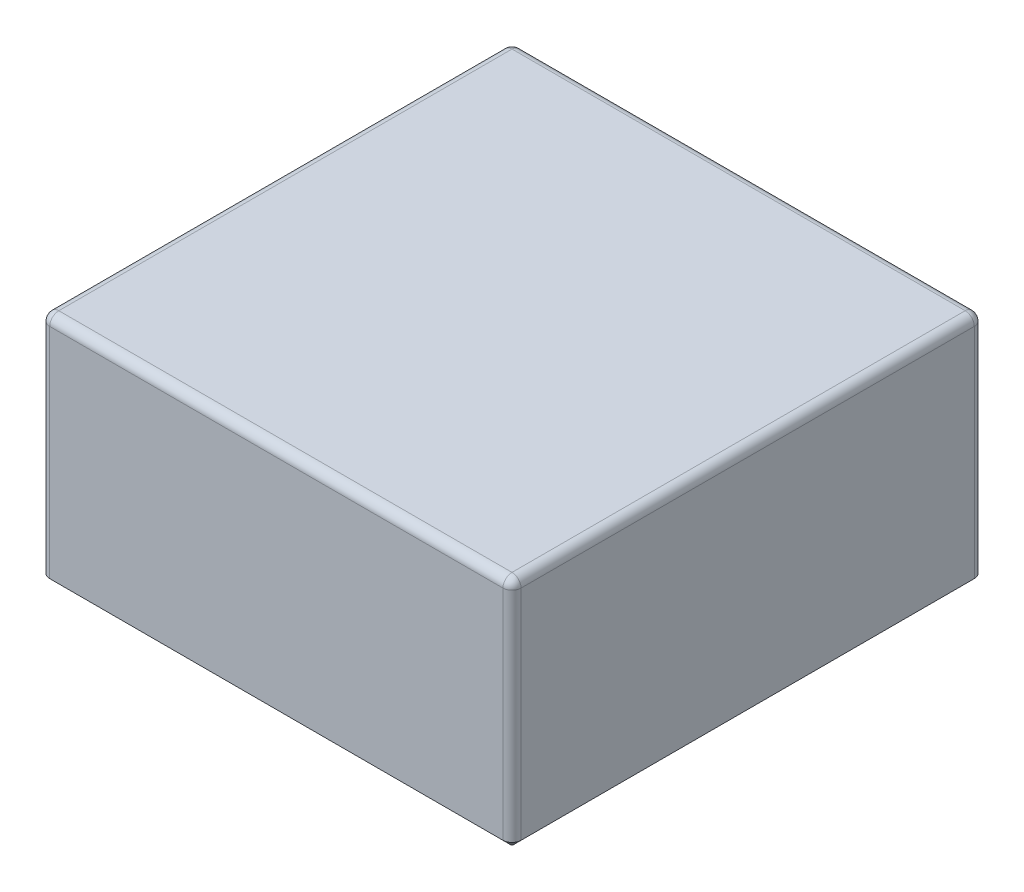
ISO-10303-21;
HEADER;
FILE_DESCRIPTION(('STEP AP214'),'2;1');
FILE_NAME('part.step','',(''),(''),'','','');
FILE_SCHEMA(('AUTOMOTIVE_DESIGN { 1 0 10303 214 1 1 1 1 }'));
ENDSEC;
DATA;
#1=APPLICATION_CONTEXT('core data for automotive mechanical design processes');
#2=APPLICATION_PROTOCOL_DEFINITION('international standard','automotive_design',2000,#1);
#3=PRODUCT_CONTEXT('',#1,'mechanical');
#4=PRODUCT('Part','Part','',(#3));
#5=PRODUCT_RELATED_PRODUCT_CATEGORY('part','',(#4));
#6=PRODUCT_DEFINITION_FORMATION('','',#4);
#7=PRODUCT_DEFINITION_CONTEXT('part definition',#1,'design');
#8=PRODUCT_DEFINITION('design','',#6,#7);
#9=PRODUCT_DEFINITION_SHAPE('','',#8);
#10=(LENGTH_UNIT() NAMED_UNIT(*) SI_UNIT(.MILLI.,.METRE.));
#11=(NAMED_UNIT(*) PLANE_ANGLE_UNIT() SI_UNIT($,.RADIAN.));
#12=(NAMED_UNIT(*) SI_UNIT($,.STERADIAN.) SOLID_ANGLE_UNIT());
#13=UNCERTAINTY_MEASURE_WITH_UNIT(LENGTH_MEASURE(1.E-05),#10,'distance_accuracy_value','');
#14=(GEOMETRIC_REPRESENTATION_CONTEXT(3) GLOBAL_UNCERTAINTY_ASSIGNED_CONTEXT((#13)) GLOBAL_UNIT_ASSIGNED_CONTEXT((#10,
#11,#12)) REPRESENTATION_CONTEXT('',''));
#15=CARTESIAN_POINT('',(0.,0.,0.));
#16=DIRECTION('',(0.,0.,1.));
#17=DIRECTION('',(1.,0.,0.));
#18=AXIS2_PLACEMENT_3D('',#15,#16,#17);
#19=CARTESIAN_POINT('',(0.,0.01,0.));
#20=DIRECTION('',(0.,1.,0.));
#21=DIRECTION('',(0.,0.,-1.));
#22=AXIS2_PLACEMENT_3D('',#19,#20,#21);
#23=PLANE('',#22);
#24=DIRECTION('',(0.,0.,-1.));
#25=VECTOR('',#24,1.);
#26=CARTESIAN_POINT('',(-0.25,0.01,0.25));
#27=LINE('',#26,#25);
#28=CARTESIAN_POINT('',(-0.25,0.01,0.25));
#29=VERTEX_POINT('',#28);
#30=CARTESIAN_POINT('',(-0.25,0.01,-0.25));
#31=VERTEX_POINT('',#30);
#32=EDGE_CURVE('E189',#29,#31,#27,.T.);
#33=ORIENTED_EDGE('',*,*,#32,.F.);
#34=DIRECTION('',(-1.,0.,0.));
#35=VECTOR('',#34,1.);
#36=CARTESIAN_POINT('',(0.25,0.01,0.25));
#37=LINE('',#36,#35);
#38=CARTESIAN_POINT('',(0.25,0.01,0.25));
#39=VERTEX_POINT('',#38);
#40=EDGE_CURVE('E204',#39,#29,#37,.T.);
#41=ORIENTED_EDGE('',*,*,#40,.F.);
#42=DIRECTION('',(0.,0.,1.));
#43=VECTOR('',#42,1.);
#44=CARTESIAN_POINT('',(0.25,0.01,-0.25));
#45=LINE('',#44,#43);
#46=CARTESIAN_POINT('',(0.25,0.01,-0.25));
#47=VERTEX_POINT('',#46);
#48=EDGE_CURVE('E180',#47,#39,#45,.T.);
#49=ORIENTED_EDGE('',*,*,#48,.F.);
#50=DIRECTION('',(1.,0.,0.));
#51=VECTOR('',#50,1.);
#52=CARTESIAN_POINT('',(-0.25,0.01,-0.25));
#53=LINE('',#52,#51);
#54=EDGE_CURVE('E11',#31,#47,#53,.T.);
#55=ORIENTED_EDGE('',*,*,#54,.F.);
#56=EDGE_LOOP('',(#33,#41,#49,#55));
#57=FACE_BOUND('',#56,.T.);
#58=ADVANCED_FACE('F17',(#57),#23,.T.);
#59=CARTESIAN_POINT('',(-0.25,0.,-0.25));
#60=DIRECTION('',(1.,0.,0.));
#61=DIRECTION('',(0.,-1.,0.));
#62=AXIS2_PLACEMENT_3D('',#59,#60,#61);
#63=CYLINDRICAL_SURFACE('',#62,0.01);
#64=DIRECTION('',(1.,0.,0.));
#65=VECTOR('',#64,1.);
#66=CARTESIAN_POINT('',(-0.25,0.,-0.26));
#67=LINE('',#66,#65);
#68=CARTESIAN_POINT('',(-0.25,0.,-0.26));
#69=VERTEX_POINT('',#68);
#70=CARTESIAN_POINT('',(0.25,0.,-0.26));
#71=VERTEX_POINT('',#70);
#72=EDGE_CURVE('E216',#69,#71,#67,.T.);
#73=ORIENTED_EDGE('',*,*,#72,.F.);
#74=CARTESIAN_POINT('',(-0.25,0.,-0.25));
#75=DIRECTION('',(1.,0.,0.));
#76=DIRECTION('',(0.,-1.,0.));
#77=AXIS2_PLACEMENT_3D('',#74,#75,#76);
#78=CIRCLE('',#77,0.01);
#79=EDGE_CURVE('E20',#69,#31,#78,.T.);
#80=ORIENTED_EDGE('',*,*,#79,.T.);
#81=ORIENTED_EDGE('',*,*,#54,.T.);
#82=CARTESIAN_POINT('',(0.25,0.,-0.25));
#83=DIRECTION('',(1.,0.,0.));
#84=DIRECTION('',(0.,-1.,0.));
#85=AXIS2_PLACEMENT_3D('',#82,#83,#84);
#86=CIRCLE('',#85,0.01);
#87=EDGE_CURVE('E265',#71,#47,#86,.T.);
#88=ORIENTED_EDGE('',*,*,#87,.F.);
#89=EDGE_LOOP('',(#73,#80,#81,#88));
#90=FACE_BOUND('',#89,.T.);
#91=ADVANCED_FACE('F274',(#90),#63,.T.);
#92=CARTESIAN_POINT('',(-0.25,0.,-0.25));
#93=DIRECTION('',(0.,0.707106781186547,0.707106781186548));
#94=DIRECTION('',(-0.707106781186549,0.5,-0.5));
#95=AXIS2_PLACEMENT_3D('',#92,#93,#94);
#96=SPHERICAL_SURFACE('',#95,0.01);
#97=CARTESIAN_POINT('',(-0.25,0.,-0.25));
#98=DIRECTION('',(0.,-1.,0.));
#99=DIRECTION('',(0.,0.,1.));
#100=AXIS2_PLACEMENT_3D('',#97,#98,#99);
#101=CIRCLE('',#100,0.01);
#102=CARTESIAN_POINT('',(-0.26,0.,-0.25));
#103=VERTEX_POINT('',#102);
#104=EDGE_CURVE('E222',#103,#69,#101,.T.);
#105=ORIENTED_EDGE('',*,*,#104,.F.);
#106=CARTESIAN_POINT('',(-0.25,0.,-0.25));
#107=DIRECTION('',(0.,0.,-1.));
#108=DIRECTION('',(0.,-1.,0.));
#109=AXIS2_PLACEMENT_3D('',#106,#107,#108);
#110=CIRCLE('',#109,0.01);
#111=EDGE_CURVE('E262',#103,#31,#110,.T.);
#112=ORIENTED_EDGE('',*,*,#111,.T.);
#113=ORIENTED_EDGE('',*,*,#79,.F.);
#114=EDGE_LOOP('',(#105,#112,#113));
#115=FACE_BOUND('',#114,.T.);
#116=ADVANCED_FACE('F277',(#115),#96,.T.);
#117=CARTESIAN_POINT('',(0.25,0.,-0.25));
#118=DIRECTION('',(-0.707106781186548,0.707106781186547,0.));
#119=DIRECTION('',(0.5,0.5,-0.707106781186549));
#120=AXIS2_PLACEMENT_3D('',#117,#118,#119);
#121=SPHERICAL_SURFACE('',#120,0.01);
#122=CARTESIAN_POINT('',(0.25,0.,-0.25));
#123=DIRECTION('',(0.,-1.,0.));
#124=DIRECTION('',(-1.,0.,0.));
#125=AXIS2_PLACEMENT_3D('',#122,#123,#124);
#126=CIRCLE('',#125,0.01);
#127=CARTESIAN_POINT('',(0.26,0.,-0.25));
#128=VERTEX_POINT('',#127);
#129=EDGE_CURVE('E243',#71,#128,#126,.T.);
#130=ORIENTED_EDGE('',*,*,#129,.F.);
#131=ORIENTED_EDGE('',*,*,#87,.T.);
#132=CARTESIAN_POINT('',(0.25,0.,-0.25));
#133=DIRECTION('',(0.,0.,1.));
#134=DIRECTION('',(0.,-1.,0.));
#135=AXIS2_PLACEMENT_3D('',#132,#133,#134);
#136=CIRCLE('',#135,0.01);
#137=EDGE_CURVE('E186',#128,#47,#136,.T.);
#138=ORIENTED_EDGE('',*,*,#137,.F.);
#139=EDGE_LOOP('',(#130,#131,#138));
#140=FACE_BOUND('',#139,.T.);
#141=ADVANCED_FACE('F475',(#140),#121,.T.);
#142=CARTESIAN_POINT('',(-0.25,0.,0.25));
#143=DIRECTION('',(0.,0.,-1.));
#144=DIRECTION('',(0.,-1.,0.));
#145=AXIS2_PLACEMENT_3D('',#142,#143,#144);
#146=CYLINDRICAL_SURFACE('',#145,0.01);
#147=DIRECTION('',(0.,0.,-1.));
#148=VECTOR('',#147,1.);
#149=CARTESIAN_POINT('',(-0.26,0.,0.25));
#150=LINE('',#149,#148);
#151=CARTESIAN_POINT('',(-0.26,0.,0.25));
#152=VERTEX_POINT('',#151);
#153=EDGE_CURVE('E233',#152,#103,#150,.T.);
#154=ORIENTED_EDGE('',*,*,#153,.F.);
#155=CARTESIAN_POINT('',(-0.25,0.,0.25));
#156=DIRECTION('',(0.,0.,-1.));
#157=DIRECTION('',(0.,-1.,0.));
#158=AXIS2_PLACEMENT_3D('',#155,#156,#157);
#159=CIRCLE('',#158,0.01);
#160=EDGE_CURVE('E200',#152,#29,#159,.T.);
#161=ORIENTED_EDGE('',*,*,#160,.T.);
#162=ORIENTED_EDGE('',*,*,#32,.T.);
#163=ORIENTED_EDGE('',*,*,#111,.F.);
#164=EDGE_LOOP('',(#154,#161,#162,#163));
#165=FACE_BOUND('',#164,.T.);
#166=ADVANCED_FACE('F281',(#165),#146,.T.);
#167=CARTESIAN_POINT('',(0.25,0.,-0.25));
#168=DIRECTION('',(0.,0.,1.));
#169=DIRECTION('',(0.,-1.,0.));
#170=AXIS2_PLACEMENT_3D('',#167,#168,#169);
#171=CYLINDRICAL_SURFACE('',#170,0.01);
#172=DIRECTION('',(0.,0.,1.));
#173=VECTOR('',#172,1.);
#174=CARTESIAN_POINT('',(0.26,0.,-0.25));
#175=LINE('',#174,#173);
#176=CARTESIAN_POINT('',(0.26,0.,0.25));
#177=VERTEX_POINT('',#176);
#178=EDGE_CURVE('E232',#128,#177,#175,.T.);
#179=ORIENTED_EDGE('',*,*,#178,.F.);
#180=ORIENTED_EDGE('',*,*,#137,.T.);
#181=ORIENTED_EDGE('',*,*,#48,.T.);
#182=CARTESIAN_POINT('',(0.25,0.,0.25));
#183=DIRECTION('',(0.,0.,1.));
#184=DIRECTION('',(0.,-1.,0.));
#185=AXIS2_PLACEMENT_3D('',#182,#183,#184);
#186=CIRCLE('',#185,0.01);
#187=EDGE_CURVE('E184',#177,#39,#186,.T.);
#188=ORIENTED_EDGE('',*,*,#187,.F.);
#189=EDGE_LOOP('',(#179,#180,#181,#188));
#190=FACE_BOUND('',#189,.T.);
#191=ADVANCED_FACE('F183',(#190),#171,.T.);
#192=CARTESIAN_POINT('',(-0.25,0.,0.25));
#193=DIRECTION('',(0.,-0.707106781186549,0.707106781186546));
#194=DIRECTION('',(-0.707106781186546,0.5,0.5));
#195=AXIS2_PLACEMENT_3D('',#192,#193,#194);
#196=SPHERICAL_SURFACE('',#195,0.01);
#197=CARTESIAN_POINT('',(-0.25,0.,0.25));
#198=DIRECTION('',(0.,1.,0.));
#199=DIRECTION('',(0.,0.,-1.));
#200=AXIS2_PLACEMENT_3D('',#197,#198,#199);
#201=CIRCLE('',#200,0.01);
#202=CARTESIAN_POINT('',(-0.25,0.,0.26));
#203=VERTEX_POINT('',#202);
#204=EDGE_CURVE('E229',#152,#203,#201,.T.);
#205=ORIENTED_EDGE('',*,*,#204,.T.);
#206=CARTESIAN_POINT('',(-0.25,0.,0.25));
#207=DIRECTION('',(-1.,0.,0.));
#208=DIRECTION('',(0.,-1.,0.));
#209=AXIS2_PLACEMENT_3D('',#206,#207,#208);
#210=CIRCLE('',#209,0.01);
#211=EDGE_CURVE('E201',#203,#29,#210,.T.);
#212=ORIENTED_EDGE('',*,*,#211,.T.);
#213=ORIENTED_EDGE('',*,*,#160,.F.);
#214=EDGE_LOOP('',(#205,#212,#213));
#215=FACE_BOUND('',#214,.T.);
#216=ADVANCED_FACE('F285',(#215),#196,.T.);
#217=CARTESIAN_POINT('',(0.25,0.,0.25));
#218=DIRECTION('',(0.,0.707106781186547,-0.707106781186548));
#219=DIRECTION('',(0.707106781186549,0.5,0.5));
#220=AXIS2_PLACEMENT_3D('',#217,#218,#219);
#221=SPHERICAL_SURFACE('',#220,0.01);
#222=CARTESIAN_POINT('',(0.25,0.,0.25));
#223=DIRECTION('',(0.,-1.,0.));
#224=DIRECTION('',(0.,0.,-1.));
#225=AXIS2_PLACEMENT_3D('',#222,#223,#224);
#226=CIRCLE('',#225,0.01);
#227=CARTESIAN_POINT('',(0.25,0.,0.26));
#228=VERTEX_POINT('',#227);
#229=EDGE_CURVE('E197',#177,#228,#226,.T.);
#230=ORIENTED_EDGE('',*,*,#229,.F.);
#231=ORIENTED_EDGE('',*,*,#187,.T.);
#232=CARTESIAN_POINT('',(0.25,0.,0.25));
#233=DIRECTION('',(-1.,0.,0.));
#234=DIRECTION('',(0.,-1.,0.));
#235=AXIS2_PLACEMENT_3D('',#232,#233,#234);
#236=CIRCLE('',#235,0.01);
#237=EDGE_CURVE('E195',#228,#39,#236,.T.);
#238=ORIENTED_EDGE('',*,*,#237,.F.);
#239=EDGE_LOOP('',(#230,#231,#238));
#240=FACE_BOUND('',#239,.T.);
#241=ADVANCED_FACE('F193',(#240),#221,.T.);
#242=CARTESIAN_POINT('',(0.25,0.,0.25));
#243=DIRECTION('',(-1.,0.,0.));
#244=DIRECTION('',(0.,-1.,0.));
#245=AXIS2_PLACEMENT_3D('',#242,#243,#244);
#246=CYLINDRICAL_SURFACE('',#245,0.01);
#247=DIRECTION('',(-1.,0.,0.));
#248=VECTOR('',#247,1.);
#249=CARTESIAN_POINT('',(0.25,0.,0.26));
#250=LINE('',#249,#248);
#251=EDGE_CURVE('E213',#228,#203,#250,.T.);
#252=ORIENTED_EDGE('',*,*,#251,.F.);
#253=ORIENTED_EDGE('',*,*,#237,.T.);
#254=ORIENTED_EDGE('',*,*,#40,.T.);
#255=ORIENTED_EDGE('',*,*,#211,.F.);
#256=EDGE_LOOP('',(#252,#253,#254,#255));
#257=FACE_BOUND('',#256,.T.);
#258=ADVANCED_FACE('F211',(#257),#246,.T.);
#259=CARTESIAN_POINT('',(0.,0.,0.));
#260=DIRECTION('',(0.,1.,0.));
#261=DIRECTION('',(0.,0.,-1.));
#262=AXIS2_PLACEMENT_3D('',#259,#260,#261);
#263=PLANE('',#262);
#264=DIRECTION('',(0.,0.,-1.));
#265=VECTOR('',#264,1.);
#266=CARTESIAN_POINT('',(-0.25,0.,0.25));
#267=LINE('',#266,#265);
#268=CARTESIAN_POINT('',(-0.25,0.,0.25));
#269=VERTEX_POINT('',#268);
#270=CARTESIAN_POINT('',(-0.25,0.,-0.25));
#271=VERTEX_POINT('',#270);
#272=EDGE_CURVE('E433',#269,#271,#267,.T.);
#273=ORIENTED_EDGE('',*,*,#272,.T.);
#274=DIRECTION('',(1.,0.,0.));
#275=VECTOR('',#274,1.);
#276=CARTESIAN_POINT('',(-0.25,0.,-0.25));
#277=LINE('',#276,#275);
#278=CARTESIAN_POINT('',(0.25,0.,-0.25));
#279=VERTEX_POINT('',#278);
#280=EDGE_CURVE('E440',#271,#279,#277,.T.);
#281=ORIENTED_EDGE('',*,*,#280,.T.);
#282=DIRECTION('',(0.,0.,1.));
#283=VECTOR('',#282,1.);
#284=CARTESIAN_POINT('',(0.25,0.,-0.25));
#285=LINE('',#284,#283);
#286=CARTESIAN_POINT('',(0.25,0.,0.25));
#287=VERTEX_POINT('',#286);
#288=EDGE_CURVE('E423',#279,#287,#285,.T.);
#289=ORIENTED_EDGE('',*,*,#288,.T.);
#290=DIRECTION('',(-1.,0.,0.));
#291=VECTOR('',#290,1.);
#292=CARTESIAN_POINT('',(0.25,0.,0.25));
#293=LINE('',#292,#291);
#294=EDGE_CURVE('E309',#287,#269,#293,.T.);
#295=ORIENTED_EDGE('',*,*,#294,.T.);
#296=EDGE_LOOP('',(#273,#281,#289,#295));
#297=FACE_BOUND('',#296,.T.);
#298=ADVANCED_FACE('F555',(#297),#263,.F.);
#299=CARTESIAN_POINT('',(-0.25,0.,-0.26));
#300=DIRECTION('',(0.,0.,1.));
#301=DIRECTION('',(1.,0.,0.));
#302=AXIS2_PLACEMENT_3D('',#299,#300,#301);
#303=PLANE('',#302);
#304=DIRECTION('',(0.,-1.,0.));
#305=VECTOR('',#304,1.);
#306=CARTESIAN_POINT('',(0.25,0.,-0.26));
#307=LINE('',#306,#305);
#308=CARTESIAN_POINT('',(0.25,-0.241,-0.26));
#309=VERTEX_POINT('',#308);
#310=EDGE_CURVE('E240',#71,#309,#307,.T.);
#311=ORIENTED_EDGE('',*,*,#310,.T.);
#312=DIRECTION('',(1.,0.,0.));
#313=VECTOR('',#312,1.);
#314=CARTESIAN_POINT('',(-0.25,-0.241,-0.26));
#315=LINE('',#314,#313);
#316=CARTESIAN_POINT('',(-0.25,-0.241,-0.26));
#317=VERTEX_POINT('',#316);
#318=EDGE_CURVE('E346',#317,#309,#315,.T.);
#319=ORIENTED_EDGE('',*,*,#318,.F.);
#320=DIRECTION('',(0.,-1.,0.));
#321=VECTOR('',#320,1.);
#322=CARTESIAN_POINT('',(-0.25,0.,-0.26));
#323=LINE('',#322,#321);
#324=EDGE_CURVE('E247',#69,#317,#323,.T.);
#325=ORIENTED_EDGE('',*,*,#324,.F.);
#326=ORIENTED_EDGE('',*,*,#72,.T.);
#327=EDGE_LOOP('',(#311,#319,#325,#326));
#328=FACE_BOUND('',#327,.T.);
#329=ADVANCED_FACE('F551',(#328),#303,.F.);
#330=CARTESIAN_POINT('',(-0.25,0.,-0.25));
#331=DIRECTION('',(0.,-1.,0.));
#332=DIRECTION('',(0.,0.,1.));
#333=AXIS2_PLACEMENT_3D('',#330,#331,#332);
#334=CYLINDRICAL_SURFACE('',#333,0.01);
#335=ORIENTED_EDGE('',*,*,#324,.T.);
#336=CARTESIAN_POINT('',(-0.25,-0.241,-0.25));
#337=DIRECTION('',(0.,-1.,0.));
#338=DIRECTION('',(-1.,0.,0.));
#339=AXIS2_PLACEMENT_3D('',#336,#337,#338);
#340=CIRCLE('',#339,0.01);
#341=CARTESIAN_POINT('',(-0.26,-0.241,-0.25));
#342=VERTEX_POINT('',#341);
#343=EDGE_CURVE('E415',#342,#317,#340,.T.);
#344=ORIENTED_EDGE('',*,*,#343,.F.);
#345=DIRECTION('',(0.,-1.,0.));
#346=VECTOR('',#345,1.);
#347=CARTESIAN_POINT('',(-0.26,0.,-0.25));
#348=LINE('',#347,#346);
#349=EDGE_CURVE('E237',#103,#342,#348,.T.);
#350=ORIENTED_EDGE('',*,*,#349,.F.);
#351=ORIENTED_EDGE('',*,*,#104,.T.);
#352=EDGE_LOOP('',(#335,#344,#350,#351));
#353=FACE_BOUND('',#352,.T.);
#354=ADVANCED_FACE('F510',(#353),#334,.T.);
#355=CARTESIAN_POINT('',(0.25,0.,-0.25));
#356=DIRECTION('',(0.,-1.,0.));
#357=DIRECTION('',(-1.,0.,0.));
#358=AXIS2_PLACEMENT_3D('',#355,#356,#357);
#359=CYLINDRICAL_SURFACE('',#358,0.01);
#360=DIRECTION('',(0.,-1.,0.));
#361=VECTOR('',#360,1.);
#362=CARTESIAN_POINT('',(0.26,0.,-0.25));
#363=LINE('',#362,#361);
#364=CARTESIAN_POINT('',(0.26,-0.241,-0.25));
#365=VERTEX_POINT('',#364);
#366=EDGE_CURVE('E228',#128,#365,#363,.T.);
#367=ORIENTED_EDGE('',*,*,#366,.T.);
#368=CARTESIAN_POINT('',(0.25,-0.241,-0.25));
#369=DIRECTION('',(0.,-1.,0.));
#370=DIRECTION('',(0.,0.,-1.));
#371=AXIS2_PLACEMENT_3D('',#368,#369,#370);
#372=CIRCLE('',#371,0.01);
#373=EDGE_CURVE('E412',#309,#365,#372,.T.);
#374=ORIENTED_EDGE('',*,*,#373,.F.);
#375=ORIENTED_EDGE('',*,*,#310,.F.);
#376=ORIENTED_EDGE('',*,*,#129,.T.);
#377=EDGE_LOOP('',(#367,#374,#375,#376));
#378=FACE_BOUND('',#377,.T.);
#379=ADVANCED_FACE('F474',(#378),#359,.T.);
#380=CARTESIAN_POINT('',(-0.26,0.,0.25));
#381=DIRECTION('',(1.,0.,0.));
#382=DIRECTION('',(0.,1.,0.));
#383=AXIS2_PLACEMENT_3D('',#380,#381,#382);
#384=PLANE('',#383);
#385=DIRECTION('',(0.,-1.,0.));
#386=VECTOR('',#385,1.);
#387=CARTESIAN_POINT('',(-0.26,0.,0.25));
#388=LINE('',#387,#386);
#389=CARTESIAN_POINT('',(-0.26,-0.241,0.25));
#390=VERTEX_POINT('',#389);
#391=EDGE_CURVE('E226',#152,#390,#388,.T.);
#392=ORIENTED_EDGE('',*,*,#391,.F.);
#393=ORIENTED_EDGE('',*,*,#153,.T.);
#394=ORIENTED_EDGE('',*,*,#349,.T.);
#395=DIRECTION('',(0.,0.,-1.));
#396=VECTOR('',#395,1.);
#397=CARTESIAN_POINT('',(-0.26,-0.241,0.25));
#398=LINE('',#397,#396);
#399=EDGE_CURVE('E400',#390,#342,#398,.T.);
#400=ORIENTED_EDGE('',*,*,#399,.F.);
#401=EDGE_LOOP('',(#392,#393,#394,#400));
#402=FACE_BOUND('',#401,.T.);
#403=ADVANCED_FACE('F509',(#402),#384,.F.);
#404=CARTESIAN_POINT('',(0.26,0.,-0.25));
#405=DIRECTION('',(-1.,0.,0.));
#406=DIRECTION('',(0.,0.,1.));
#407=AXIS2_PLACEMENT_3D('',#404,#405,#406);
#408=PLANE('',#407);
#409=DIRECTION('',(0.,-1.,0.));
#410=VECTOR('',#409,1.);
#411=CARTESIAN_POINT('',(0.26,0.,0.25));
#412=LINE('',#411,#410);
#413=CARTESIAN_POINT('',(0.26,-0.241,0.25));
#414=VERTEX_POINT('',#413);
#415=EDGE_CURVE('E300',#177,#414,#412,.T.);
#416=ORIENTED_EDGE('',*,*,#415,.T.);
#417=DIRECTION('',(0.,0.,1.));
#418=VECTOR('',#417,1.);
#419=CARTESIAN_POINT('',(0.26,-0.241,-0.25));
#420=LINE('',#419,#418);
#421=EDGE_CURVE('E396',#365,#414,#420,.T.);
#422=ORIENTED_EDGE('',*,*,#421,.F.);
#423=ORIENTED_EDGE('',*,*,#366,.F.);
#424=ORIENTED_EDGE('',*,*,#178,.T.);
#425=EDGE_LOOP('',(#416,#422,#423,#424));
#426=FACE_BOUND('',#425,.T.);
#427=ADVANCED_FACE('F453',(#426),#408,.F.);
#428=CARTESIAN_POINT('',(-0.25,0.,0.25));
#429=DIRECTION('',(0.,-1.,0.));
#430=DIRECTION('',(0.,0.,-1.));
#431=AXIS2_PLACEMENT_3D('',#428,#429,#430);
#432=CYLINDRICAL_SURFACE('',#431,0.01);
#433=DIRECTION('',(0.,-1.,0.));
#434=VECTOR('',#433,1.);
#435=CARTESIAN_POINT('',(-0.25,0.,0.26));
#436=LINE('',#435,#434);
#437=CARTESIAN_POINT('',(-0.25,-0.241,0.26));
#438=VERTEX_POINT('',#437);
#439=EDGE_CURVE('E292',#203,#438,#436,.T.);
#440=ORIENTED_EDGE('',*,*,#439,.F.);
#441=ORIENTED_EDGE('',*,*,#204,.F.);
#442=ORIENTED_EDGE('',*,*,#391,.T.);
#443=CARTESIAN_POINT('',(-0.25,-0.241,0.25));
#444=DIRECTION('',(0.,-1.,0.));
#445=DIRECTION('',(0.,0.,1.));
#446=AXIS2_PLACEMENT_3D('',#443,#444,#445);
#447=CIRCLE('',#446,0.01);
#448=EDGE_CURVE('E295',#438,#390,#447,.T.);
#449=ORIENTED_EDGE('',*,*,#448,.F.);
#450=EDGE_LOOP('',(#440,#441,#442,#449));
#451=FACE_BOUND('',#450,.T.);
#452=ADVANCED_FACE('F293',(#451),#432,.T.);
#453=CARTESIAN_POINT('',(0.25,0.,0.25));
#454=DIRECTION('',(0.,-1.,0.));
#455=DIRECTION('',(0.,0.,-1.));
#456=AXIS2_PLACEMENT_3D('',#453,#454,#455);
#457=CYLINDRICAL_SURFACE('',#456,0.01);
#458=DIRECTION('',(0.,-1.,0.));
#459=VECTOR('',#458,1.);
#460=CARTESIAN_POINT('',(0.25,0.,0.26));
#461=LINE('',#460,#459);
#462=CARTESIAN_POINT('',(0.25,-0.241,0.26));
#463=VERTEX_POINT('',#462);
#464=EDGE_CURVE('E303',#228,#463,#461,.T.);
#465=ORIENTED_EDGE('',*,*,#464,.T.);
#466=CARTESIAN_POINT('',(0.25,-0.241,0.25));
#467=DIRECTION('',(0.,-1.,0.));
#468=DIRECTION('',(1.,0.,0.));
#469=AXIS2_PLACEMENT_3D('',#466,#467,#468);
#470=CIRCLE('',#469,0.01);
#471=EDGE_CURVE('E324',#414,#463,#470,.T.);
#472=ORIENTED_EDGE('',*,*,#471,.F.);
#473=ORIENTED_EDGE('',*,*,#415,.F.);
#474=ORIENTED_EDGE('',*,*,#229,.T.);
#475=EDGE_LOOP('',(#465,#472,#473,#474));
#476=FACE_BOUND('',#475,.T.);
#477=ADVANCED_FACE('F461',(#476),#457,.T.);
#478=CARTESIAN_POINT('',(0.25,0.,0.26));
#479=DIRECTION('',(0.,0.,-1.));
#480=DIRECTION('',(0.,-1.,0.));
#481=AXIS2_PLACEMENT_3D('',#478,#479,#480);
#482=PLANE('',#481);
#483=ORIENTED_EDGE('',*,*,#464,.F.);
#484=ORIENTED_EDGE('',*,*,#251,.T.);
#485=ORIENTED_EDGE('',*,*,#439,.T.);
#486=DIRECTION('',(-1.,0.,0.));
#487=VECTOR('',#486,1.);
#488=CARTESIAN_POINT('',(0.25,-0.241,0.26));
#489=LINE('',#488,#487);
#490=EDGE_CURVE('E315',#463,#438,#489,.T.);
#491=ORIENTED_EDGE('',*,*,#490,.F.);
#492=EDGE_LOOP('',(#483,#484,#485,#491));
#493=FACE_BOUND('',#492,.T.);
#494=ADVANCED_FACE('F302',(#493),#482,.F.);
#495=CARTESIAN_POINT('',(0.25,0.,0.25));
#496=DIRECTION('',(0.,0.,-1.));
#497=DIRECTION('',(0.,-1.,0.));
#498=AXIS2_PLACEMENT_3D('',#495,#496,#497);
#499=PLANE('',#498);
#500=DIRECTION('',(0.,-1.,0.));
#501=VECTOR('',#500,1.);
#502=CARTESIAN_POINT('',(0.25,0.,0.25));
#503=LINE('',#502,#501);
#504=CARTESIAN_POINT('',(0.25,-0.25,0.25));
#505=VERTEX_POINT('',#504);
#506=EDGE_CURVE('E427',#287,#505,#503,.T.);
#507=ORIENTED_EDGE('',*,*,#506,.T.);
#508=DIRECTION('',(-1.,0.,0.));
#509=VECTOR('',#508,1.);
#510=CARTESIAN_POINT('',(0.25,-0.25,0.25));
#511=LINE('',#510,#509);
#512=CARTESIAN_POINT('',(-0.25,-0.25,0.25));
#513=VERTEX_POINT('',#512);
#514=EDGE_CURVE('E334',#505,#513,#511,.T.);
#515=ORIENTED_EDGE('',*,*,#514,.T.);
#516=DIRECTION('',(0.,-1.,0.));
#517=VECTOR('',#516,1.);
#518=CARTESIAN_POINT('',(-0.25,0.,0.25));
#519=LINE('',#518,#517);
#520=EDGE_CURVE('E350',#269,#513,#519,.T.);
#521=ORIENTED_EDGE('',*,*,#520,.F.);
#522=ORIENTED_EDGE('',*,*,#294,.F.);
#523=EDGE_LOOP('',(#507,#515,#521,#522));
#524=FACE_BOUND('',#523,.T.);
#525=ADVANCED_FACE('F535',(#524),#499,.T.);
#526=CARTESIAN_POINT('',(0.25,0.,-0.25));
#527=DIRECTION('',(-1.,0.,0.));
#528=DIRECTION('',(0.,0.,1.));
#529=AXIS2_PLACEMENT_3D('',#526,#527,#528);
#530=PLANE('',#529);
#531=DIRECTION('',(0.,-1.,0.));
#532=VECTOR('',#531,1.);
#533=CARTESIAN_POINT('',(0.25,0.,-0.25));
#534=LINE('',#533,#532);
#535=CARTESIAN_POINT('',(0.25,-0.25,-0.25));
#536=VERTEX_POINT('',#535);
#537=EDGE_CURVE('E437',#279,#536,#534,.T.);
#538=ORIENTED_EDGE('',*,*,#537,.T.);
#539=DIRECTION('',(0.,0.,1.));
#540=VECTOR('',#539,1.);
#541=CARTESIAN_POINT('',(0.25,-0.25,-0.25));
#542=LINE('',#541,#540);
#543=EDGE_CURVE('E329',#536,#505,#542,.T.);
#544=ORIENTED_EDGE('',*,*,#543,.T.);
#545=ORIENTED_EDGE('',*,*,#506,.F.);
#546=ORIENTED_EDGE('',*,*,#288,.F.);
#547=EDGE_LOOP('',(#538,#544,#545,#546));
#548=FACE_BOUND('',#547,.T.);
#549=ADVANCED_FACE('F533',(#548),#530,.T.);
#550=CARTESIAN_POINT('',(-0.25,0.,-0.25));
#551=DIRECTION('',(0.,0.,1.));
#552=DIRECTION('',(1.,0.,0.));
#553=AXIS2_PLACEMENT_3D('',#550,#551,#552);
#554=PLANE('',#553);
#555=DIRECTION('',(0.,-1.,0.));
#556=VECTOR('',#555,1.);
#557=CARTESIAN_POINT('',(-0.25,0.,-0.25));
#558=LINE('',#557,#556);
#559=CARTESIAN_POINT('',(-0.25,-0.25,-0.25));
#560=VERTEX_POINT('',#559);
#561=EDGE_CURVE('E430',#271,#560,#558,.T.);
#562=ORIENTED_EDGE('',*,*,#561,.T.);
#563=DIRECTION('',(1.,0.,0.));
#564=VECTOR('',#563,1.);
#565=CARTESIAN_POINT('',(-0.25,-0.25,-0.25));
#566=LINE('',#565,#564);
#567=EDGE_CURVE('E333',#560,#536,#566,.T.);
#568=ORIENTED_EDGE('',*,*,#567,.T.);
#569=ORIENTED_EDGE('',*,*,#537,.F.);
#570=ORIENTED_EDGE('',*,*,#280,.F.);
#571=EDGE_LOOP('',(#562,#568,#569,#570));
#572=FACE_BOUND('',#571,.T.);
#573=ADVANCED_FACE('F529',(#572),#554,.T.);
#574=CARTESIAN_POINT('',(-0.25,0.,0.25));
#575=DIRECTION('',(1.,0.,0.));
#576=DIRECTION('',(0.,1.,0.));
#577=AXIS2_PLACEMENT_3D('',#574,#575,#576);
#578=PLANE('',#577);
#579=ORIENTED_EDGE('',*,*,#520,.T.);
#580=DIRECTION('',(0.,0.,-1.));
#581=VECTOR('',#580,1.);
#582=CARTESIAN_POINT('',(-0.25,-0.25,0.25));
#583=LINE('',#582,#581);
#584=EDGE_CURVE('E359',#513,#560,#583,.T.);
#585=ORIENTED_EDGE('',*,*,#584,.T.);
#586=ORIENTED_EDGE('',*,*,#561,.F.);
#587=ORIENTED_EDGE('',*,*,#272,.F.);
#588=EDGE_LOOP('',(#579,#585,#586,#587));
#589=FACE_BOUND('',#588,.T.);
#590=ADVANCED_FACE('F523',(#589),#578,.T.);
#591=CARTESIAN_POINT('',(-0.25,-0.2455,-0.2555));
#592=DIRECTION('',(0.,-0.707106781186548,-0.707106781186548));
#593=DIRECTION('',(0.,-0.707106781186548,0.707106781186548));
#594=AXIS2_PLACEMENT_3D('',#591,#592,#593);
#595=PLANE('',#594);
#596=DIRECTION('',(0.,0.707106781186548,-0.707106781186548));
#597=VECTOR('',#596,1.);
#598=CARTESIAN_POINT('',(-0.25,-0.241,-0.26));
#599=LINE('',#598,#597);
#600=CARTESIAN_POINT('',(-0.25,-0.25,-0.251));
#601=VERTEX_POINT('',#600);
#602=EDGE_CURVE('E351',#601,#317,#599,.T.);
#603=ORIENTED_EDGE('',*,*,#602,.T.);
#604=ORIENTED_EDGE('',*,*,#318,.T.);
#605=DIRECTION('',(0.,0.707106781186548,-0.707106781186548));
#606=VECTOR('',#605,1.);
#607=CARTESIAN_POINT('',(0.25,-0.2455,-0.2555));
#608=LINE('',#607,#606);
#609=CARTESIAN_POINT('',(0.25,-0.25,-0.251));
#610=VERTEX_POINT('',#609);
#611=EDGE_CURVE('E407',#610,#309,#608,.T.);
#612=ORIENTED_EDGE('',*,*,#611,.F.);
#613=DIRECTION('',(1.,0.,0.));
#614=VECTOR('',#613,1.);
#615=CARTESIAN_POINT('',(-0.25,-0.25,-0.251));
#616=LINE('',#615,#614);
#617=EDGE_CURVE('E345',#601,#610,#616,.T.);
#618=ORIENTED_EDGE('',*,*,#617,.F.);
#619=EDGE_LOOP('',(#603,#604,#612,#618));
#620=FACE_BOUND('',#619,.T.);
#621=ADVANCED_FACE('F519',(#620),#595,.T.);
#622=CARTESIAN_POINT('',(-0.25,-0.241,-0.25));
#623=DIRECTION('',(0.,1.,0.));
#624=DIRECTION('',(-1.,0.,0.));
#625=AXIS2_PLACEMENT_3D('',#622,#623,#624);
#626=CONICAL_SURFACE('',#625,0.01,0.785398163397);
#627=DIRECTION('',(-0.707106781186548,0.707106781186548,0.));
#628=VECTOR('',#627,1.);
#629=CARTESIAN_POINT('',(-0.2555,-0.2455,-0.25));
#630=LINE('',#629,#628);
#631=CARTESIAN_POINT('',(-0.251,-0.25,-0.25));
#632=VERTEX_POINT('',#631);
#633=EDGE_CURVE('E404',#632,#342,#630,.T.);
#634=ORIENTED_EDGE('',*,*,#633,.T.);
#635=ORIENTED_EDGE('',*,*,#343,.T.);
#636=ORIENTED_EDGE('',*,*,#602,.F.);
#637=CARTESIAN_POINT('',(-0.25,-0.25,-0.25));
#638=DIRECTION('',(0.,-1.,0.));
#639=DIRECTION('',(-1.,0.,0.));
#640=AXIS2_PLACEMENT_3D('',#637,#638,#639);
#641=CIRCLE('',#640,0.001);
#642=EDGE_CURVE('E340',#632,#601,#641,.T.);
#643=ORIENTED_EDGE('',*,*,#642,.F.);
#644=EDGE_LOOP('',(#634,#635,#636,#643));
#645=FACE_BOUND('',#644,.T.);
#646=ADVANCED_FACE('F512',(#645),#626,.T.);
#647=CARTESIAN_POINT('',(0.25,-0.241,-0.25));
#648=DIRECTION('',(0.,1.,0.));
#649=DIRECTION('',(0.,0.,-1.));
#650=AXIS2_PLACEMENT_3D('',#647,#648,#649);
#651=CONICAL_SURFACE('',#650,0.01,0.785398163397);
#652=ORIENTED_EDGE('',*,*,#611,.T.);
#653=ORIENTED_EDGE('',*,*,#373,.T.);
#654=DIRECTION('',(0.707106781186548,0.707106781186548,0.));
#655=VECTOR('',#654,1.);
#656=CARTESIAN_POINT('',(0.26,-0.241,-0.25));
#657=LINE('',#656,#655);
#658=CARTESIAN_POINT('',(0.251,-0.25,-0.25));
#659=VERTEX_POINT('',#658);
#660=EDGE_CURVE('E383',#659,#365,#657,.T.);
#661=ORIENTED_EDGE('',*,*,#660,.F.);
#662=CARTESIAN_POINT('',(0.25,-0.25,-0.25));
#663=DIRECTION('',(0.,-1.,0.));
#664=DIRECTION('',(0.,0.,-1.));
#665=AXIS2_PLACEMENT_3D('',#662,#663,#664);
#666=CIRCLE('',#665,0.001);
#667=EDGE_CURVE('E355',#610,#659,#666,.T.);
#668=ORIENTED_EDGE('',*,*,#667,.F.);
#669=EDGE_LOOP('',(#652,#653,#661,#668));
#670=FACE_BOUND('',#669,.T.);
#671=ADVANCED_FACE('F470',(#670),#651,.T.);
#672=CARTESIAN_POINT('',(-0.2555,-0.2455,0.25));
#673=DIRECTION('',(-0.707106781186548,-0.707106781186548,0.));
#674=DIRECTION('',(-0.707106781186548,0.707106781186548,0.));
#675=AXIS2_PLACEMENT_3D('',#672,#673,#674);
#676=PLANE('',#675);
#677=DIRECTION('',(-0.707106781186548,0.707106781186548,0.));
#678=VECTOR('',#677,1.);
#679=CARTESIAN_POINT('',(-0.26,-0.241,0.25));
#680=LINE('',#679,#678);
#681=CARTESIAN_POINT('',(-0.251,-0.25,0.25));
#682=VERTEX_POINT('',#681);
#683=EDGE_CURVE('E337',#682,#390,#680,.T.);
#684=ORIENTED_EDGE('',*,*,#683,.T.);
#685=ORIENTED_EDGE('',*,*,#399,.T.);
#686=ORIENTED_EDGE('',*,*,#633,.F.);
#687=DIRECTION('',(0.,0.,-1.));
#688=VECTOR('',#687,1.);
#689=CARTESIAN_POINT('',(-0.251,-0.25,0.25));
#690=LINE('',#689,#688);
#691=EDGE_CURVE('E328',#682,#632,#690,.T.);
#692=ORIENTED_EDGE('',*,*,#691,.F.);
#693=EDGE_LOOP('',(#684,#685,#686,#692));
#694=FACE_BOUND('',#693,.T.);
#695=ADVANCED_FACE('F506',(#694),#676,.T.);
#696=CARTESIAN_POINT('',(0.2555,-0.2455,-0.25));
#697=DIRECTION('',(0.707106781186548,-0.707106781186548,0.));
#698=DIRECTION('',(0.,0.,-1.));
#699=AXIS2_PLACEMENT_3D('',#696,#697,#698);
#700=PLANE('',#699);
#701=ORIENTED_EDGE('',*,*,#660,.T.);
#702=ORIENTED_EDGE('',*,*,#421,.T.);
#703=DIRECTION('',(0.707106781186548,0.707106781186548,0.));
#704=VECTOR('',#703,1.);
#705=CARTESIAN_POINT('',(0.2555,-0.2455,0.25));
#706=LINE('',#705,#704);
#707=CARTESIAN_POINT('',(0.251,-0.25,0.25));
#708=VERTEX_POINT('',#707);
#709=EDGE_CURVE('E314',#708,#414,#706,.T.);
#710=ORIENTED_EDGE('',*,*,#709,.F.);
#711=DIRECTION('',(0.,0.,1.));
#712=VECTOR('',#711,1.);
#713=CARTESIAN_POINT('',(0.251,-0.25,-0.25));
#714=LINE('',#713,#712);
#715=EDGE_CURVE('E363',#659,#708,#714,.T.);
#716=ORIENTED_EDGE('',*,*,#715,.F.);
#717=EDGE_LOOP('',(#701,#702,#710,#716));
#718=FACE_BOUND('',#717,.T.);
#719=ADVANCED_FACE('F458',(#718),#700,.T.);
#720=CARTESIAN_POINT('',(-0.25,-0.241,0.25));
#721=DIRECTION('',(0.,1.,0.));
#722=DIRECTION('',(0.,0.,1.));
#723=AXIS2_PLACEMENT_3D('',#720,#721,#722);
#724=CONICAL_SURFACE('',#723,0.01,0.785398163397);
#725=DIRECTION('',(0.,0.707106781186548,0.707106781186548));
#726=VECTOR('',#725,1.);
#727=CARTESIAN_POINT('',(-0.25,-0.2455,0.2555));
#728=LINE('',#727,#726);
#729=CARTESIAN_POINT('',(-0.25,-0.25,0.251));
#730=VERTEX_POINT('',#729);
#731=EDGE_CURVE('E312',#730,#438,#728,.T.);
#732=ORIENTED_EDGE('',*,*,#731,.T.);
#733=ORIENTED_EDGE('',*,*,#448,.T.);
#734=ORIENTED_EDGE('',*,*,#683,.F.);
#735=CARTESIAN_POINT('',(-0.25,-0.25,0.25));
#736=DIRECTION('',(0.,-1.,0.));
#737=DIRECTION('',(0.,0.,1.));
#738=AXIS2_PLACEMENT_3D('',#735,#736,#737);
#739=CIRCLE('',#738,0.001);
#740=EDGE_CURVE('E320',#730,#682,#739,.T.);
#741=ORIENTED_EDGE('',*,*,#740,.F.);
#742=EDGE_LOOP('',(#732,#733,#734,#741));
#743=FACE_BOUND('',#742,.T.);
#744=ADVANCED_FACE('F498',(#743),#724,.T.);
#745=CARTESIAN_POINT('',(0.25,-0.241,0.25));
#746=DIRECTION('',(0.,1.,0.));
#747=DIRECTION('',(1.,0.,0.));
#748=AXIS2_PLACEMENT_3D('',#745,#746,#747);
#749=CONICAL_SURFACE('',#748,0.01,0.785398163397);
#750=ORIENTED_EDGE('',*,*,#709,.T.);
#751=ORIENTED_EDGE('',*,*,#471,.T.);
#752=DIRECTION('',(0.,0.707106781186548,0.707106781186548));
#753=VECTOR('',#752,1.);
#754=CARTESIAN_POINT('',(0.25,-0.2455,0.2555));
#755=LINE('',#754,#753);
#756=CARTESIAN_POINT('',(0.25,-0.25,0.251));
#757=VERTEX_POINT('',#756);
#758=EDGE_CURVE('E368',#757,#463,#755,.T.);
#759=ORIENTED_EDGE('',*,*,#758,.F.);
#760=CARTESIAN_POINT('',(0.25,-0.25,0.25));
#761=DIRECTION('',(0.,-1.,0.));
#762=DIRECTION('',(1.,0.,0.));
#763=AXIS2_PLACEMENT_3D('',#760,#761,#762);
#764=CIRCLE('',#763,0.001);
#765=EDGE_CURVE('E366',#708,#757,#764,.T.);
#766=ORIENTED_EDGE('',*,*,#765,.F.);
#767=EDGE_LOOP('',(#750,#751,#759,#766));
#768=FACE_BOUND('',#767,.T.);
#769=ADVANCED_FACE('F463',(#768),#749,.T.);
#770=CARTESIAN_POINT('',(0.25,-0.2455,0.2555));
#771=DIRECTION('',(0.,-0.707106781186548,0.707106781186548));
#772=DIRECTION('',(-1.,0.,0.));
#773=AXIS2_PLACEMENT_3D('',#770,#771,#772);
#774=PLANE('',#773);
#775=ORIENTED_EDGE('',*,*,#758,.T.);
#776=ORIENTED_EDGE('',*,*,#490,.T.);
#777=ORIENTED_EDGE('',*,*,#731,.F.);
#778=DIRECTION('',(-1.,0.,0.));
#779=VECTOR('',#778,1.);
#780=CARTESIAN_POINT('',(0.25,-0.25,0.251));
#781=LINE('',#780,#779);
#782=EDGE_CURVE('E316',#757,#730,#781,.T.);
#783=ORIENTED_EDGE('',*,*,#782,.F.);
#784=EDGE_LOOP('',(#775,#776,#777,#783));
#785=FACE_BOUND('',#784,.T.);
#786=ADVANCED_FACE('F497',(#785),#774,.T.);
#787=CARTESIAN_POINT('',(0.,-0.25,0.));
#788=DIRECTION('',(0.,1.,0.));
#789=DIRECTION('',(0.,0.,-1.));
#790=AXIS2_PLACEMENT_3D('',#787,#788,#789);
#791=PLANE('',#790);
#792=ORIENTED_EDGE('',*,*,#584,.F.);
#793=ORIENTED_EDGE('',*,*,#514,.F.);
#794=ORIENTED_EDGE('',*,*,#543,.F.);
#795=ORIENTED_EDGE('',*,*,#567,.F.);
#796=EDGE_LOOP('',(#792,#793,#794,#795));
#797=FACE_BOUND('',#796,.T.);
#798=ORIENTED_EDGE('',*,*,#782,.T.);
#799=ORIENTED_EDGE('',*,*,#740,.T.);
#800=ORIENTED_EDGE('',*,*,#691,.T.);
#801=ORIENTED_EDGE('',*,*,#642,.T.);
#802=ORIENTED_EDGE('',*,*,#617,.T.);
#803=ORIENTED_EDGE('',*,*,#667,.T.);
#804=ORIENTED_EDGE('',*,*,#715,.T.);
#805=ORIENTED_EDGE('',*,*,#765,.T.);
#806=EDGE_LOOP('',(#798,#799,#800,#801,#802,#803,#804,#805));
#807=FACE_BOUND('',#806,.T.);
#808=ADVANCED_FACE('F466',(#797,#807),#791,.F.);
#809=CLOSED_SHELL('',(#58,#91,#116,#141,#166,#191,#216,#241,#258,#298,#329,#354,#379,#403,#427,
#452,#477,#494,#525,#549,#573,#590,#621,#646,#671,#695,#719,#744,#769,#786,#808));
#810=MANIFOLD_SOLID_BREP('B1',#809);
#811=ADVANCED_BREP_SHAPE_REPRESENTATION('',(#18,#810),#14);
#812=SHAPE_DEFINITION_REPRESENTATION(#9,#811);
ENDSEC;
END-ISO-10303-21;
